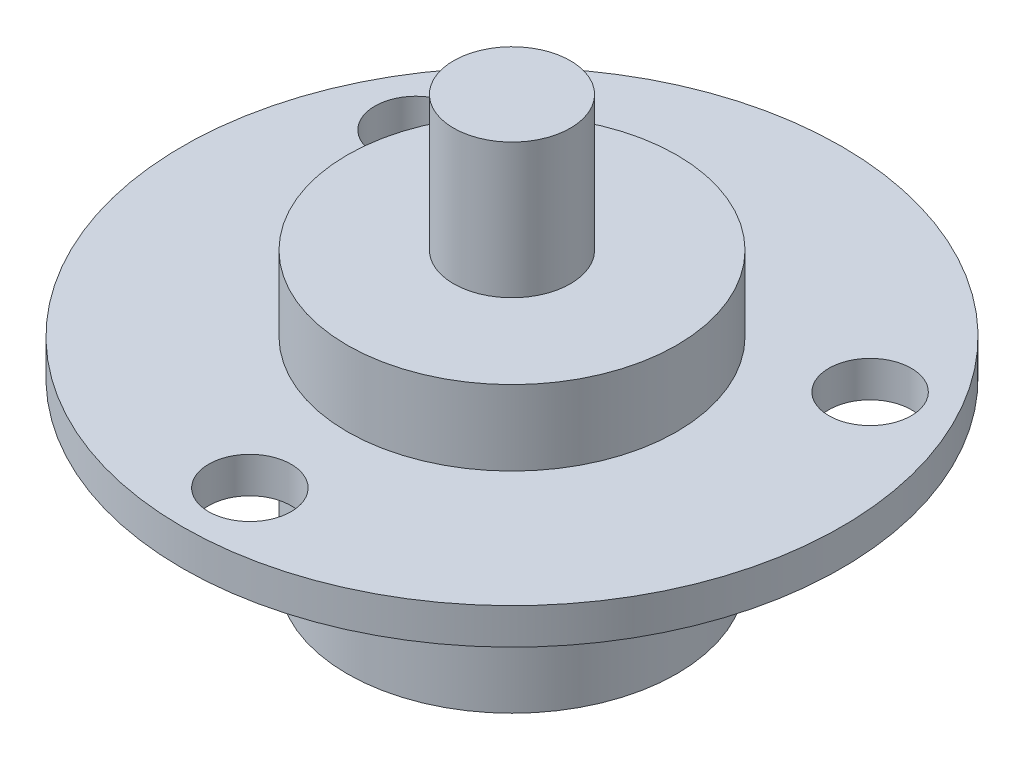
ISO-10303-21;
HEADER;
FILE_DESCRIPTION(('STEP AP214'),'2;1');
FILE_NAME('part.step','',(''),(''),'','','');
FILE_SCHEMA(('AUTOMOTIVE_DESIGN { 1 0 10303 214 1 1 1 1 }'));
ENDSEC;
DATA;
#1=APPLICATION_CONTEXT('core data for automotive mechanical design processes');
#2=APPLICATION_PROTOCOL_DEFINITION('international standard','automotive_design',2000,#1);
#3=PRODUCT_CONTEXT('',#1,'mechanical');
#4=PRODUCT('Part','Part','',(#3));
#5=PRODUCT_RELATED_PRODUCT_CATEGORY('part','',(#4));
#6=PRODUCT_DEFINITION_FORMATION('','',#4);
#7=PRODUCT_DEFINITION_CONTEXT('part definition',#1,'design');
#8=PRODUCT_DEFINITION('design','',#6,#7);
#9=PRODUCT_DEFINITION_SHAPE('','',#8);
#10=(LENGTH_UNIT() NAMED_UNIT(*) SI_UNIT(.MILLI.,.METRE.));
#11=(NAMED_UNIT(*) PLANE_ANGLE_UNIT() SI_UNIT($,.RADIAN.));
#12=(NAMED_UNIT(*) SI_UNIT($,.STERADIAN.) SOLID_ANGLE_UNIT());
#13=UNCERTAINTY_MEASURE_WITH_UNIT(LENGTH_MEASURE(1.E-05),#10,'distance_accuracy_value','');
#14=(GEOMETRIC_REPRESENTATION_CONTEXT(3) GLOBAL_UNCERTAINTY_ASSIGNED_CONTEXT((#13)) GLOBAL_UNIT_ASSIGNED_CONTEXT((#10,
#11,#12)) REPRESENTATION_CONTEXT('',''));
#15=CARTESIAN_POINT('',(0.,0.,0.));
#16=DIRECTION('',(0.,0.,1.));
#17=DIRECTION('',(1.,0.,0.));
#18=AXIS2_PLACEMENT_3D('',#15,#16,#17);
#19=CARTESIAN_POINT('',(0.,19.,0.));
#20=DIRECTION('',(0.,-1.,0.));
#21=DIRECTION('',(0.,0.,-1.));
#22=AXIS2_PLACEMENT_3D('',#19,#20,#21);
#23=CYLINDRICAL_SURFACE('',#22,11.);
#24=CARTESIAN_POINT('',(0.,14.,0.));
#25=DIRECTION('',(0.,1.,0.));
#26=DIRECTION('',(0.,0.,1.));
#27=AXIS2_PLACEMENT_3D('',#24,#25,#26);
#28=CIRCLE('',#27,11.);
#29=CARTESIAN_POINT('',(0.,14.,11.));
#30=VERTEX_POINT('',#29);
#31=EDGE_CURVE('E54',#30,#30,#28,.T.);
#32=ORIENTED_EDGE('',*,*,#31,.T.);
#33=EDGE_LOOP('',(#32));
#34=FACE_BOUND('',#33,.T.);
#35=CARTESIAN_POINT('',(0.,19.,0.));
#36=DIRECTION('',(0.,1.,0.));
#37=DIRECTION('',(0.,0.,1.));
#38=AXIS2_PLACEMENT_3D('',#35,#36,#37);
#39=CIRCLE('',#38,11.);
#40=CARTESIAN_POINT('',(0.,19.,11.));
#41=VERTEX_POINT('',#40);
#42=EDGE_CURVE('E42',#41,#41,#39,.T.);
#43=ORIENTED_EDGE('',*,*,#42,.F.);
#44=EDGE_LOOP('',(#43));
#45=FACE_BOUND('',#44,.T.);
#46=ADVANCED_FACE('F32',(#34,#45),#23,.T.);
#47=CARTESIAN_POINT('',(0.,19.,0.));
#48=DIRECTION('',(0.,1.,0.));
#49=DIRECTION('',(0.,0.,1.));
#50=AXIS2_PLACEMENT_3D('',#47,#48,#49);
#51=PLANE('',#50);
#52=CARTESIAN_POINT('',(0.,19.,0.));
#53=DIRECTION('',(0.,1.,0.));
#54=DIRECTION('',(0.,0.,1.));
#55=AXIS2_PLACEMENT_3D('',#52,#53,#54);
#56=CIRCLE('',#55,3.9);
#57=CARTESIAN_POINT('',(0.,19.,3.9));
#58=VERTEX_POINT('',#57);
#59=EDGE_CURVE('E38',#58,#58,#56,.T.);
#60=ORIENTED_EDGE('',*,*,#59,.F.);
#61=EDGE_LOOP('',(#60));
#62=FACE_BOUND('',#61,.T.);
#63=ORIENTED_EDGE('',*,*,#42,.T.);
#64=EDGE_LOOP('',(#63));
#65=FACE_BOUND('',#64,.T.);
#66=ADVANCED_FACE('F122',(#62,#65),#51,.T.);
#67=CARTESIAN_POINT('',(0.,28.,0.));
#68=DIRECTION('',(0.,-1.,0.));
#69=DIRECTION('',(0.,0.,-1.));
#70=AXIS2_PLACEMENT_3D('',#67,#68,#69);
#71=CYLINDRICAL_SURFACE('',#70,3.9);
#72=CARTESIAN_POINT('',(0.,28.,0.));
#73=DIRECTION('',(0.,1.,0.));
#74=DIRECTION('',(0.,0.,1.));
#75=AXIS2_PLACEMENT_3D('',#72,#73,#74);
#76=CIRCLE('',#75,3.9);
#77=CARTESIAN_POINT('',(0.,28.,3.9));
#78=VERTEX_POINT('',#77);
#79=EDGE_CURVE('E50',#78,#78,#76,.T.);
#80=ORIENTED_EDGE('',*,*,#79,.F.);
#81=EDGE_LOOP('',(#80));
#82=FACE_BOUND('',#81,.T.);
#83=ORIENTED_EDGE('',*,*,#59,.T.);
#84=EDGE_LOOP('',(#83));
#85=FACE_BOUND('',#84,.T.);
#86=ADVANCED_FACE('F118',(#82,#85),#71,.T.);
#87=CARTESIAN_POINT('',(0.,28.,0.));
#88=DIRECTION('',(0.,1.,0.));
#89=DIRECTION('',(0.,0.,1.));
#90=AXIS2_PLACEMENT_3D('',#87,#88,#89);
#91=PLANE('',#90);
#92=ORIENTED_EDGE('',*,*,#79,.T.);
#93=EDGE_LOOP('',(#92));
#94=FACE_BOUND('',#93,.T.);
#95=ADVANCED_FACE('F111',(#94),#91,.T.);
#96=CARTESIAN_POINT('',(0.,11.6,0.));
#97=DIRECTION('',(0.,1.,0.));
#98=DIRECTION('',(0.,0.,1.));
#99=AXIS2_PLACEMENT_3D('',#96,#97,#98);
#100=CYLINDRICAL_SURFACE('',#99,22.);
#101=CARTESIAN_POINT('',(0.,11.6,0.));
#102=DIRECTION('',(0.,1.,0.));
#103=DIRECTION('',(0.,0.,1.));
#104=AXIS2_PLACEMENT_3D('',#101,#102,#103);
#105=CIRCLE('',#104,22.);
#106=CARTESIAN_POINT('',(0.,11.6,22.));
#107=VERTEX_POINT('',#106);
#108=EDGE_CURVE('E56',#107,#107,#105,.T.);
#109=ORIENTED_EDGE('',*,*,#108,.T.);
#110=EDGE_LOOP('',(#109));
#111=FACE_BOUND('',#110,.T.);
#112=CARTESIAN_POINT('',(0.,14.,0.));
#113=DIRECTION('',(0.,1.,0.));
#114=DIRECTION('',(0.,0.,1.));
#115=AXIS2_PLACEMENT_3D('',#112,#113,#114);
#116=CIRCLE('',#115,22.);
#117=CARTESIAN_POINT('',(0.,14.,22.));
#118=VERTEX_POINT('',#117);
#119=EDGE_CURVE('E61',#118,#118,#116,.T.);
#120=ORIENTED_EDGE('',*,*,#119,.F.);
#121=EDGE_LOOP('',(#120));
#122=FACE_BOUND('',#121,.T.);
#123=ADVANCED_FACE('F109',(#111,#122),#100,.T.);
#124=CARTESIAN_POINT('',(0.,11.6,0.));
#125=DIRECTION('',(0.,1.,0.));
#126=DIRECTION('',(0.,0.,1.));
#127=AXIS2_PLACEMENT_3D('',#124,#125,#126);
#128=PLANE('',#127);
#129=CARTESIAN_POINT('',(0.,11.6,0.));
#130=DIRECTION('',(0.,1.,0.));
#131=DIRECTION('',(0.,0.,1.));
#132=AXIS2_PLACEMENT_3D('',#129,#130,#131);
#133=CIRCLE('',#132,11.);
#134=CARTESIAN_POINT('',(0.,11.6,11.));
#135=VERTEX_POINT('',#134);
#136=EDGE_CURVE('E10',#135,#135,#133,.T.);
#137=ORIENTED_EDGE('',*,*,#136,.T.);
#138=EDGE_LOOP('',(#137));
#139=FACE_BOUND('',#138,.T.);
#140=CARTESIAN_POINT('',(15.1554445662278,11.6,-8.74999999999986));
#141=DIRECTION('',(0.,1.,0.));
#142=DIRECTION('',(0.,0.,1.));
#143=AXIS2_PLACEMENT_3D('',#140,#141,#142);
#144=CIRCLE('',#143,2.75);
#145=CARTESIAN_POINT('',(15.1554445662278,11.6,-5.99999999999986));
#146=VERTEX_POINT('',#145);
#147=EDGE_CURVE('E77',#146,#146,#144,.T.);
#148=ORIENTED_EDGE('',*,*,#147,.T.);
#149=EDGE_LOOP('',(#148));
#150=FACE_BOUND('',#149,.T.);
#151=CARTESIAN_POINT('',(-15.1554445662276,11.6,-8.75000000000007));
#152=DIRECTION('',(0.,1.,0.));
#153=DIRECTION('',(0.,0.,1.));
#154=AXIS2_PLACEMENT_3D('',#151,#152,#153);
#155=CIRCLE('',#154,2.75);
#156=CARTESIAN_POINT('',(-15.1554445662276,11.6,-6.00000000000007));
#157=VERTEX_POINT('',#156);
#158=EDGE_CURVE('E71',#157,#157,#155,.T.);
#159=ORIENTED_EDGE('',*,*,#158,.T.);
#160=EDGE_LOOP('',(#159));
#161=FACE_BOUND('',#160,.T.);
#162=CARTESIAN_POINT('',(0.,11.6,17.5));
#163=DIRECTION('',(0.,1.,0.));
#164=DIRECTION('',(0.,0.,1.));
#165=AXIS2_PLACEMENT_3D('',#162,#163,#164);
#166=CIRCLE('',#165,2.75);
#167=CARTESIAN_POINT('',(0.,11.6,20.25));
#168=VERTEX_POINT('',#167);
#169=EDGE_CURVE('E66',#168,#168,#166,.T.);
#170=ORIENTED_EDGE('',*,*,#169,.T.);
#171=EDGE_LOOP('',(#170));
#172=FACE_BOUND('',#171,.T.);
#173=ORIENTED_EDGE('',*,*,#108,.F.);
#174=EDGE_LOOP('',(#173));
#175=FACE_BOUND('',#174,.T.);
#176=ADVANCED_FACE('F86',(#139,#150,#161,#172,#175),#128,.F.);
#177=CARTESIAN_POINT('',(0.,14.,0.));
#178=DIRECTION('',(0.,1.,0.));
#179=DIRECTION('',(0.,0.,1.));
#180=AXIS2_PLACEMENT_3D('',#177,#178,#179);
#181=PLANE('',#180);
#182=ORIENTED_EDGE('',*,*,#31,.F.);
#183=EDGE_LOOP('',(#182));
#184=FACE_BOUND('',#183,.T.);
#185=CARTESIAN_POINT('',(15.1554445662278,14.,-8.74999999999986));
#186=DIRECTION('',(0.,1.,0.));
#187=DIRECTION('',(0.,0.,1.));
#188=AXIS2_PLACEMENT_3D('',#185,#186,#187);
#189=CIRCLE('',#188,2.75);
#190=CARTESIAN_POINT('',(15.1554445662278,14.,-5.99999999999986));
#191=VERTEX_POINT('',#190);
#192=EDGE_CURVE('E80',#191,#191,#189,.T.);
#193=ORIENTED_EDGE('',*,*,#192,.F.);
#194=EDGE_LOOP('',(#193));
#195=FACE_BOUND('',#194,.T.);
#196=CARTESIAN_POINT('',(-15.1554445662276,14.,-8.75000000000007));
#197=DIRECTION('',(0.,1.,0.));
#198=DIRECTION('',(0.,0.,1.));
#199=AXIS2_PLACEMENT_3D('',#196,#197,#198);
#200=CIRCLE('',#199,2.75);
#201=CARTESIAN_POINT('',(-15.1554445662276,14.,-6.00000000000007));
#202=VERTEX_POINT('',#201);
#203=EDGE_CURVE('E74',#202,#202,#200,.T.);
#204=ORIENTED_EDGE('',*,*,#203,.F.);
#205=EDGE_LOOP('',(#204));
#206=FACE_BOUND('',#205,.T.);
#207=CARTESIAN_POINT('',(0.,14.,17.5));
#208=DIRECTION('',(0.,1.,0.));
#209=DIRECTION('',(0.,0.,1.));
#210=AXIS2_PLACEMENT_3D('',#207,#208,#209);
#211=CIRCLE('',#210,2.75);
#212=CARTESIAN_POINT('',(0.,14.,20.25));
#213=VERTEX_POINT('',#212);
#214=EDGE_CURVE('E68',#213,#213,#211,.T.);
#215=ORIENTED_EDGE('',*,*,#214,.F.);
#216=EDGE_LOOP('',(#215));
#217=FACE_BOUND('',#216,.T.);
#218=ORIENTED_EDGE('',*,*,#119,.T.);
#219=EDGE_LOOP('',(#218));
#220=FACE_BOUND('',#219,.T.);
#221=ADVANCED_FACE('F97',(#184,#195,#206,#217,#220),#181,.T.);
#222=CARTESIAN_POINT('',(0.,11.6,17.5));
#223=DIRECTION('',(0.,1.,0.));
#224=DIRECTION('',(0.,0.,1.));
#225=AXIS2_PLACEMENT_3D('',#222,#223,#224);
#226=CYLINDRICAL_SURFACE('',#225,2.75);
#227=ORIENTED_EDGE('',*,*,#169,.F.);
#228=EDGE_LOOP('',(#227));
#229=FACE_BOUND('',#228,.T.);
#230=ORIENTED_EDGE('',*,*,#214,.T.);
#231=EDGE_LOOP('',(#230));
#232=FACE_BOUND('',#231,.T.);
#233=ADVANCED_FACE('F100',(#229,#232),#226,.F.);
#234=CARTESIAN_POINT('',(-15.1554445662276,11.6,-8.75000000000007));
#235=DIRECTION('',(0.,1.,0.));
#236=DIRECTION('',(0.,0.,1.));
#237=AXIS2_PLACEMENT_3D('',#234,#235,#236);
#238=CYLINDRICAL_SURFACE('',#237,2.75);
#239=ORIENTED_EDGE('',*,*,#158,.F.);
#240=EDGE_LOOP('',(#239));
#241=FACE_BOUND('',#240,.T.);
#242=ORIENTED_EDGE('',*,*,#203,.T.);
#243=EDGE_LOOP('',(#242));
#244=FACE_BOUND('',#243,.T.);
#245=ADVANCED_FACE('F93',(#241,#244),#238,.F.);
#246=CARTESIAN_POINT('',(15.1554445662278,11.6,-8.74999999999986));
#247=DIRECTION('',(0.,1.,0.));
#248=DIRECTION('',(0.,0.,1.));
#249=AXIS2_PLACEMENT_3D('',#246,#247,#248);
#250=CYLINDRICAL_SURFACE('',#249,2.75);
#251=ORIENTED_EDGE('',*,*,#147,.F.);
#252=EDGE_LOOP('',(#251));
#253=FACE_BOUND('',#252,.T.);
#254=ORIENTED_EDGE('',*,*,#192,.T.);
#255=EDGE_LOOP('',(#254));
#256=FACE_BOUND('',#255,.T.);
#257=ADVANCED_FACE('F89',(#253,#256),#250,.F.);
#258=CARTESIAN_POINT('',(0.,0.,0.));
#259=DIRECTION('',(0.,1.,0.));
#260=DIRECTION('',(0.,0.,1.));
#261=AXIS2_PLACEMENT_3D('',#258,#259,#260);
#262=PLANE('',#261);
#263=CARTESIAN_POINT('',(0.,0.,0.));
#264=DIRECTION('',(0.,1.,0.));
#265=DIRECTION('',(0.,0.,1.));
#266=AXIS2_PLACEMENT_3D('',#263,#264,#265);
#267=CIRCLE('',#266,11.);
#268=CARTESIAN_POINT('',(0.,0.,11.));
#269=VERTEX_POINT('',#268);
#270=EDGE_CURVE('E47',#269,#269,#267,.T.);
#271=ORIENTED_EDGE('',*,*,#270,.F.);
#272=EDGE_LOOP('',(#271));
#273=FACE_BOUND('',#272,.T.);
#274=ADVANCED_FACE('F92',(#273),#262,.F.);
#275=ORIENTED_EDGE('',*,*,#270,.T.);
#276=EDGE_LOOP('',(#275));
#277=FACE_BOUND('',#276,.T.);
#278=ORIENTED_EDGE('',*,*,#136,.F.);
#279=EDGE_LOOP('',(#278));
#280=FACE_BOUND('',#279,.T.);
#281=ADVANCED_FACE('F123',(#277,#280),#23,.T.);
#282=CLOSED_SHELL('',(#46,#66,#86,#95,#123,#176,#221,#233,#245,#257,#274,#281));
#283=MANIFOLD_SOLID_BREP('B2',#282);
#284=ADVANCED_BREP_SHAPE_REPRESENTATION('',(#18,#283),#14);
#285=SHAPE_DEFINITION_REPRESENTATION(#9,#284);
ENDSEC;
END-ISO-10303-21;
